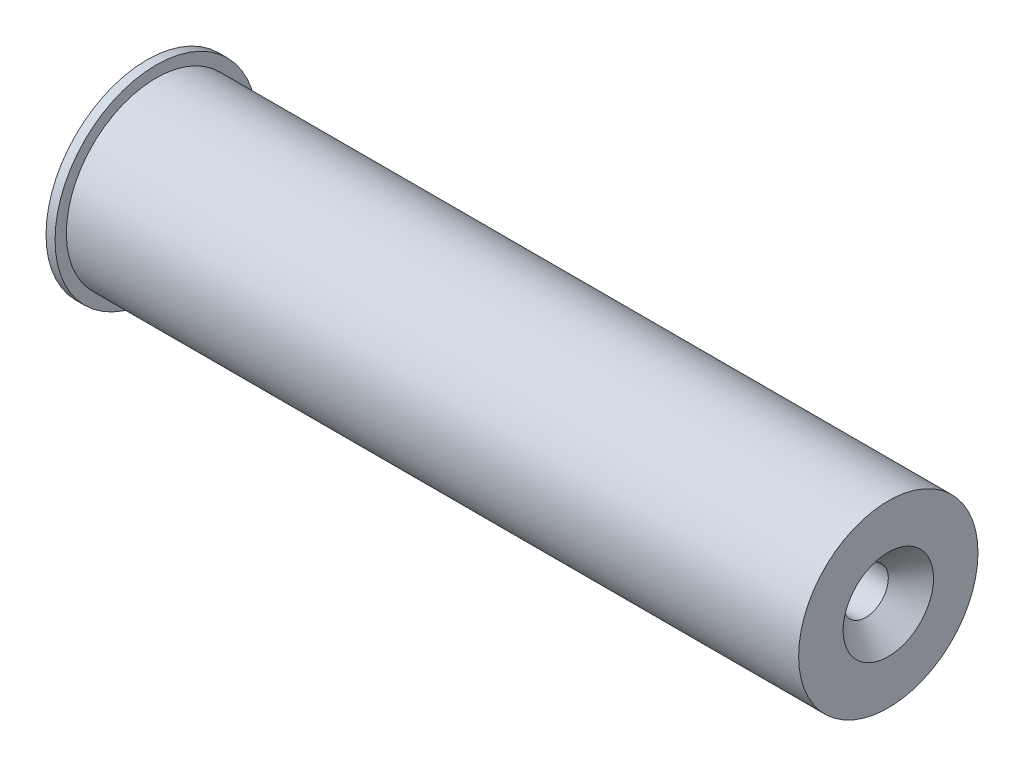
ISO-10303-21;
HEADER;
FILE_DESCRIPTION(('STEP AP214'),'2;1');
FILE_NAME('part.step','',(''),(''),'','','');
FILE_SCHEMA(('AUTOMOTIVE_DESIGN { 1 0 10303 214 1 1 1 1 }'));
ENDSEC;
DATA;
#1=APPLICATION_CONTEXT('core data for automotive mechanical design processes');
#2=APPLICATION_PROTOCOL_DEFINITION('international standard','automotive_design',2000,#1);
#3=PRODUCT_CONTEXT('',#1,'mechanical');
#4=PRODUCT('Part','Part','',(#3));
#5=PRODUCT_RELATED_PRODUCT_CATEGORY('part','',(#4));
#6=PRODUCT_DEFINITION_FORMATION('','',#4);
#7=PRODUCT_DEFINITION_CONTEXT('part definition',#1,'design');
#8=PRODUCT_DEFINITION('design','',#6,#7);
#9=PRODUCT_DEFINITION_SHAPE('','',#8);
#10=(LENGTH_UNIT() NAMED_UNIT(*) SI_UNIT(.MILLI.,.METRE.));
#11=(NAMED_UNIT(*) PLANE_ANGLE_UNIT() SI_UNIT($,.RADIAN.));
#12=(NAMED_UNIT(*) SI_UNIT($,.STERADIAN.) SOLID_ANGLE_UNIT());
#13=UNCERTAINTY_MEASURE_WITH_UNIT(LENGTH_MEASURE(1.E-05),#10,'distance_accuracy_value','');
#14=(GEOMETRIC_REPRESENTATION_CONTEXT(3) GLOBAL_UNCERTAINTY_ASSIGNED_CONTEXT((#13)) GLOBAL_UNIT_ASSIGNED_CONTEXT((#10,
#11,#12)) REPRESENTATION_CONTEXT('',''));
#15=CARTESIAN_POINT('',(0.,0.,0.));
#16=DIRECTION('',(0.,0.,1.));
#17=DIRECTION('',(1.,0.,0.));
#18=AXIS2_PLACEMENT_3D('',#15,#16,#17);
#19=CARTESIAN_POINT('',(208.28,0.,0.));
#20=DIRECTION('',(-1.,0.,0.));
#21=DIRECTION('',(0.,0.,1.));
#22=AXIS2_PLACEMENT_3D('',#19,#20,#21);
#23=CYLINDRICAL_SURFACE('',#22,25.2);
#24=CARTESIAN_POINT('',(208.28,0.,0.));
#25=DIRECTION('',(1.,0.,0.));
#26=DIRECTION('',(0.,0.,-1.));
#27=AXIS2_PLACEMENT_3D('',#24,#25,#26);
#28=CIRCLE('',#27,25.2);
#29=CARTESIAN_POINT('',(208.28,0.,-25.2));
#30=VERTEX_POINT('',#29);
#31=EDGE_CURVE('E58',#30,#30,#28,.T.);
#32=ORIENTED_EDGE('',*,*,#31,.F.);
#33=EDGE_LOOP('',(#32));
#34=FACE_BOUND('',#33,.T.);
#35=CARTESIAN_POINT('',(2.53999999999999,0.,0.));
#36=DIRECTION('',(-1.,0.,0.));
#37=DIRECTION('',(0.,0.,1.));
#38=AXIS2_PLACEMENT_3D('',#35,#36,#37);
#39=CIRCLE('',#38,25.2);
#40=CARTESIAN_POINT('',(2.53999999999999,0.,25.2));
#41=VERTEX_POINT('',#40);
#42=EDGE_CURVE('E53',#41,#41,#39,.T.);
#43=ORIENTED_EDGE('',*,*,#42,.F.);
#44=EDGE_LOOP('',(#43));
#45=FACE_BOUND('',#44,.T.);
#46=ADVANCED_FACE('F39',(#34,#45),#23,.T.);
#47=CARTESIAN_POINT('',(208.28,0.,0.));
#48=DIRECTION('',(1.,0.,0.));
#49=DIRECTION('',(0.,0.,-1.));
#50=AXIS2_PLACEMENT_3D('',#47,#48,#49);
#51=PLANE('',#50);
#52=CARTESIAN_POINT('',(208.28,0.,0.));
#53=DIRECTION('',(1.,0.,0.));
#54=DIRECTION('',(0.,0.,-1.));
#55=AXIS2_PLACEMENT_3D('',#52,#53,#54);
#56=CIRCLE('',#55,12.7);
#57=CARTESIAN_POINT('',(208.28,0.,-12.7));
#58=VERTEX_POINT('',#57);
#59=EDGE_CURVE('E10',#58,#58,#56,.F.);
#60=ORIENTED_EDGE('',*,*,#59,.T.);
#61=EDGE_LOOP('',(#60));
#62=FACE_BOUND('',#61,.T.);
#63=ORIENTED_EDGE('',*,*,#31,.T.);
#64=EDGE_LOOP('',(#63));
#65=FACE_BOUND('',#64,.T.);
#66=ADVANCED_FACE('F92',(#62,#65),#51,.T.);
#67=CARTESIAN_POINT('',(2.54,0.,0.));
#68=DIRECTION('',(-1.,0.,0.));
#69=DIRECTION('',(0.,0.,1.));
#70=AXIS2_PLACEMENT_3D('',#67,#68,#69);
#71=CYLINDRICAL_SURFACE('',#70,28.375);
#72=CARTESIAN_POINT('',(2.54,0.,0.));
#73=DIRECTION('',(-1.,0.,0.));
#74=DIRECTION('',(0.,0.,1.));
#75=AXIS2_PLACEMENT_3D('',#72,#73,#74);
#76=CIRCLE('',#75,28.375);
#77=CARTESIAN_POINT('',(2.54,0.,28.375));
#78=VERTEX_POINT('',#77);
#79=EDGE_CURVE('E64',#78,#78,#76,.T.);
#80=ORIENTED_EDGE('',*,*,#79,.T.);
#81=EDGE_LOOP('',(#80));
#82=FACE_BOUND('',#81,.T.);
#83=CARTESIAN_POINT('',(0.,0.,0.));
#84=DIRECTION('',(-1.,0.,0.));
#85=DIRECTION('',(0.,0.,1.));
#86=AXIS2_PLACEMENT_3D('',#83,#84,#85);
#87=CIRCLE('',#86,28.375);
#88=CARTESIAN_POINT('',(0.,0.,28.375));
#89=VERTEX_POINT('',#88);
#90=EDGE_CURVE('E65',#89,#89,#87,.T.);
#91=ORIENTED_EDGE('',*,*,#90,.F.);
#92=EDGE_LOOP('',(#91));
#93=FACE_BOUND('',#92,.T.);
#94=ADVANCED_FACE('F97',(#82,#93),#71,.T.);
#95=CARTESIAN_POINT('',(2.54,0.,0.));
#96=DIRECTION('',(-1.,0.,0.));
#97=DIRECTION('',(0.,0.,1.));
#98=AXIS2_PLACEMENT_3D('',#95,#96,#97);
#99=PLANE('',#98);
#100=ORIENTED_EDGE('',*,*,#42,.T.);
#101=EDGE_LOOP('',(#100));
#102=FACE_BOUND('',#101,.T.);
#103=ORIENTED_EDGE('',*,*,#79,.F.);
#104=EDGE_LOOP('',(#103));
#105=FACE_BOUND('',#104,.T.);
#106=ADVANCED_FACE('F88',(#102,#105),#99,.F.);
#107=CARTESIAN_POINT('',(0.,0.,0.));
#108=DIRECTION('',(1.,0.,0.));
#109=DIRECTION('',(0.,0.,-1.));
#110=AXIS2_PLACEMENT_3D('',#107,#108,#109);
#111=PLANE('',#110);
#112=CARTESIAN_POINT('',(0.,0.,0.));
#113=DIRECTION('',(1.,0.,0.));
#114=DIRECTION('',(0.,0.,-1.));
#115=AXIS2_PLACEMENT_3D('',#112,#113,#114);
#116=CIRCLE('',#115,6.35);
#117=CARTESIAN_POINT('',(0.,0.,-6.35));
#118=VERTEX_POINT('',#117);
#119=EDGE_CURVE('E69',#118,#118,#116,.T.);
#120=ORIENTED_EDGE('',*,*,#119,.T.);
#121=EDGE_LOOP('',(#120));
#122=FACE_BOUND('',#121,.T.);
#123=ORIENTED_EDGE('',*,*,#90,.T.);
#124=EDGE_LOOP('',(#123));
#125=FACE_BOUND('',#124,.T.);
#126=ADVANCED_FACE('F77',(#122,#125),#111,.F.);
#127=CARTESIAN_POINT('',(0.,0.,0.));
#128=DIRECTION('',(1.,0.,0.));
#129=DIRECTION('',(0.,0.,-1.));
#130=AXIS2_PLACEMENT_3D('',#127,#128,#129);
#131=CYLINDRICAL_SURFACE('',#130,6.35);
#132=CARTESIAN_POINT('',(201.93,0.,0.));
#133=DIRECTION('',(1.,0.,0.));
#134=DIRECTION('',(0.,0.,-1.));
#135=AXIS2_PLACEMENT_3D('',#132,#133,#134);
#136=CIRCLE('',#135,6.35);
#137=CARTESIAN_POINT('',(201.93,0.,-6.35));
#138=VERTEX_POINT('',#137);
#139=EDGE_CURVE('E48',#138,#138,#136,.T.);
#140=ORIENTED_EDGE('',*,*,#139,.T.);
#141=EDGE_LOOP('',(#140));
#142=FACE_BOUND('',#141,.T.);
#143=ORIENTED_EDGE('',*,*,#119,.F.);
#144=EDGE_LOOP('',(#143));
#145=FACE_BOUND('',#144,.T.);
#146=ADVANCED_FACE('F80',(#142,#145),#131,.F.);
#147=CARTESIAN_POINT('',(201.93,0.,0.));
#148=DIRECTION('',(1.,0.,0.));
#149=DIRECTION('',(0.,0.,-1.));
#150=AXIS2_PLACEMENT_3D('',#147,#148,#149);
#151=CONICAL_SURFACE('',#150,6.35,0.78539816339745);
#152=ORIENTED_EDGE('',*,*,#59,.F.);
#153=EDGE_LOOP('',(#152));
#154=FACE_BOUND('',#153,.T.);
#155=ORIENTED_EDGE('',*,*,#139,.F.);
#156=EDGE_LOOP('',(#155));
#157=FACE_BOUND('',#156,.T.);
#158=ADVANCED_FACE('F42',(#154,#157),#151,.F.);
#159=CLOSED_SHELL('',(#46,#66,#94,#106,#126,#146,#158));
#160=MANIFOLD_SOLID_BREP('B2',#159);
#161=ADVANCED_BREP_SHAPE_REPRESENTATION('',(#18,#160),#14);
#162=SHAPE_DEFINITION_REPRESENTATION(#9,#161);
ENDSEC;
END-ISO-10303-21;
